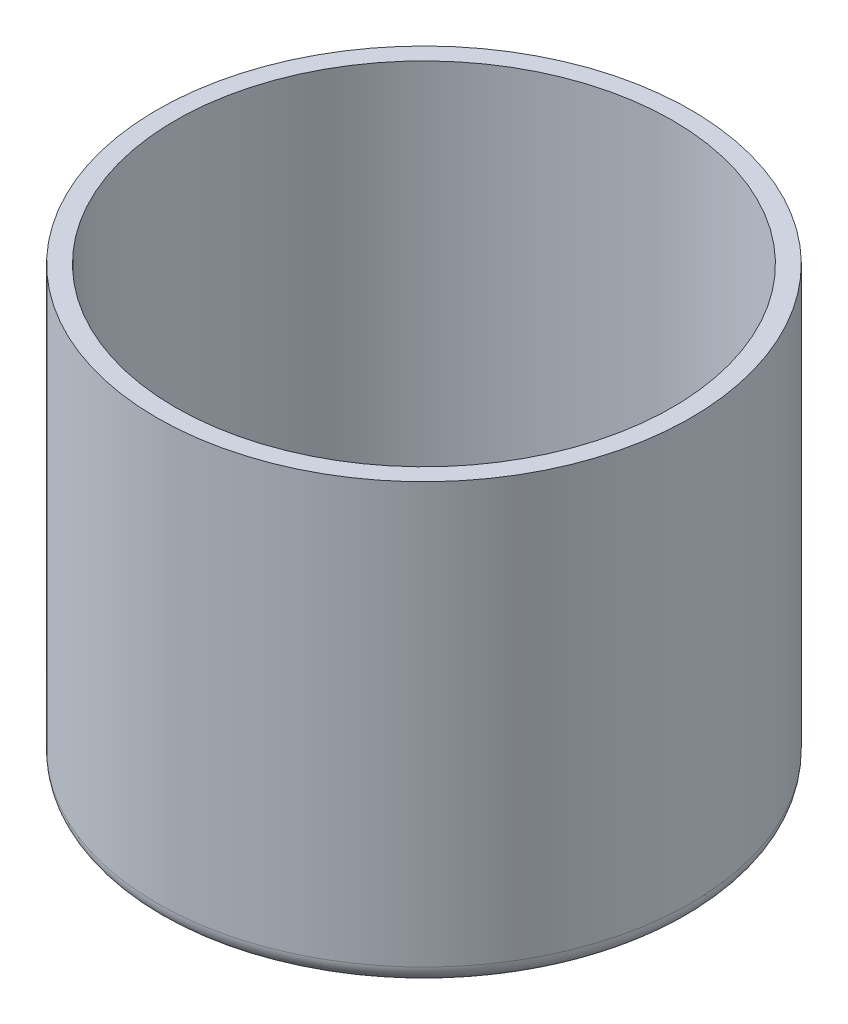
ISO-10303-21;
HEADER;
FILE_DESCRIPTION(('STEP AP214'),'2;1');
FILE_NAME('part.step','',(''),(''),'','','');
FILE_SCHEMA(('AUTOMOTIVE_DESIGN { 1 0 10303 214 1 1 1 1 }'));
ENDSEC;
DATA;
#1=APPLICATION_CONTEXT('core data for automotive mechanical design processes');
#2=APPLICATION_PROTOCOL_DEFINITION('international standard','automotive_design',2000,#1);
#3=PRODUCT_CONTEXT('',#1,'mechanical');
#4=PRODUCT('Part','Part','',(#3));
#5=PRODUCT_RELATED_PRODUCT_CATEGORY('part','',(#4));
#6=PRODUCT_DEFINITION_FORMATION('','',#4);
#7=PRODUCT_DEFINITION_CONTEXT('part definition',#1,'design');
#8=PRODUCT_DEFINITION('design','',#6,#7);
#9=PRODUCT_DEFINITION_SHAPE('','',#8);
#10=(LENGTH_UNIT() NAMED_UNIT(*) SI_UNIT(.MILLI.,.METRE.));
#11=(NAMED_UNIT(*) PLANE_ANGLE_UNIT() SI_UNIT($,.RADIAN.));
#12=(NAMED_UNIT(*) SI_UNIT($,.STERADIAN.) SOLID_ANGLE_UNIT());
#13=UNCERTAINTY_MEASURE_WITH_UNIT(LENGTH_MEASURE(1.E-05),#10,'distance_accuracy_value','');
#14=(GEOMETRIC_REPRESENTATION_CONTEXT(3) GLOBAL_UNCERTAINTY_ASSIGNED_CONTEXT((#13)) GLOBAL_UNIT_ASSIGNED_CONTEXT((#10,
#11,#12)) REPRESENTATION_CONTEXT('',''));
#15=CARTESIAN_POINT('',(0.,0.,0.));
#16=DIRECTION('',(0.,0.,1.));
#17=DIRECTION('',(1.,0.,0.));
#18=AXIS2_PLACEMENT_3D('',#15,#16,#17);
#19=CARTESIAN_POINT('',(0.,115.,0.));
#20=DIRECTION('',(0.,-1.,0.));
#21=DIRECTION('',(0.,0.,-1.));
#22=AXIS2_PLACEMENT_3D('',#19,#20,#21);
#23=CYLINDRICAL_SURFACE('',#22,73.);
#24=CARTESIAN_POINT('',(0.,0.,0.));
#25=DIRECTION('',(0.,1.,0.));
#26=DIRECTION('',(0.,0.,1.));
#27=AXIS2_PLACEMENT_3D('',#24,#25,#26);
#28=CIRCLE('',#27,73.);
#29=CARTESIAN_POINT('',(0.,0.,73.));
#30=VERTEX_POINT('',#29);
#31=EDGE_CURVE('E50',#30,#30,#28,.T.);
#32=ORIENTED_EDGE('',*,*,#31,.T.);
#33=EDGE_LOOP('',(#32));
#34=FACE_BOUND('',#33,.T.);
#35=CARTESIAN_POINT('',(0.,115.,0.));
#36=DIRECTION('',(0.,1.,0.));
#37=DIRECTION('',(0.,0.,1.));
#38=AXIS2_PLACEMENT_3D('',#35,#36,#37);
#39=CIRCLE('',#38,73.);
#40=CARTESIAN_POINT('',(0.,115.,73.));
#41=VERTEX_POINT('',#40);
#42=EDGE_CURVE('E53',#41,#41,#39,.T.);
#43=ORIENTED_EDGE('',*,*,#42,.F.);
#44=EDGE_LOOP('',(#43));
#45=FACE_BOUND('',#44,.T.);
#46=ADVANCED_FACE('F33',(#34,#45),#23,.T.);
#47=CARTESIAN_POINT('',(0.,115.,0.));
#48=DIRECTION('',(0.,1.,0.));
#49=DIRECTION('',(0.,0.,1.));
#50=AXIS2_PLACEMENT_3D('',#47,#48,#49);
#51=PLANE('',#50);
#52=CARTESIAN_POINT('',(0.,115.,0.));
#53=DIRECTION('',(0.,1.,0.));
#54=DIRECTION('',(0.,0.,1.));
#55=AXIS2_PLACEMENT_3D('',#52,#53,#54);
#56=CIRCLE('',#55,68.);
#57=CARTESIAN_POINT('',(0.,115.,68.));
#58=VERTEX_POINT('',#57);
#59=EDGE_CURVE('E56',#58,#58,#56,.T.);
#60=ORIENTED_EDGE('',*,*,#59,.F.);
#61=EDGE_LOOP('',(#60));
#62=FACE_BOUND('',#61,.T.);
#63=ORIENTED_EDGE('',*,*,#42,.T.);
#64=EDGE_LOOP('',(#63));
#65=FACE_BOUND('',#64,.T.);
#66=ADVANCED_FACE('F66',(#62,#65),#51,.T.);
#67=CARTESIAN_POINT('',(0.,-5.,0.));
#68=DIRECTION('',(0.,1.,0.));
#69=DIRECTION('',(0.,0.,1.));
#70=AXIS2_PLACEMENT_3D('',#67,#68,#69);
#71=PLANE('',#70);
#72=CARTESIAN_POINT('',(0.,-5.,0.));
#73=DIRECTION('',(0.,1.,0.));
#74=DIRECTION('',(0.,0.,1.));
#75=AXIS2_PLACEMENT_3D('',#72,#73,#74);
#76=CIRCLE('',#75,42.5);
#77=CARTESIAN_POINT('',(0.,-5.,42.5));
#78=VERTEX_POINT('',#77);
#79=EDGE_CURVE('E10',#78,#78,#76,.T.);
#80=ORIENTED_EDGE('',*,*,#79,.T.);
#81=EDGE_LOOP('',(#80));
#82=FACE_BOUND('',#81,.T.);
#83=CARTESIAN_POINT('',(0.,-5.,0.));
#84=DIRECTION('',(0.,1.,0.));
#85=DIRECTION('',(0.,0.,1.));
#86=AXIS2_PLACEMENT_3D('',#83,#84,#85);
#87=CIRCLE('',#86,68.);
#88=CARTESIAN_POINT('',(0.,-5.,68.));
#89=VERTEX_POINT('',#88);
#90=EDGE_CURVE('E45',#89,#89,#87,.F.);
#91=ORIENTED_EDGE('',*,*,#90,.T.);
#92=EDGE_LOOP('',(#91));
#93=FACE_BOUND('',#92,.T.);
#94=ADVANCED_FACE('F69',(#82,#93),#71,.F.);
#95=CARTESIAN_POINT('',(0.,115.,0.));
#96=DIRECTION('',(0.,-1.,0.));
#97=DIRECTION('',(0.,0.,-1.));
#98=AXIS2_PLACEMENT_3D('',#95,#96,#97);
#99=CYLINDRICAL_SURFACE('',#98,68.);
#100=ORIENTED_EDGE('',*,*,#59,.T.);
#101=EDGE_LOOP('',(#100));
#102=FACE_BOUND('',#101,.T.);
#103=CARTESIAN_POINT('',(0.,0.,0.));
#104=DIRECTION('',(0.,1.,0.));
#105=DIRECTION('',(0.,0.,1.));
#106=AXIS2_PLACEMENT_3D('',#103,#104,#105);
#107=CIRCLE('',#106,68.);
#108=CARTESIAN_POINT('',(0.,0.,68.));
#109=VERTEX_POINT('',#108);
#110=EDGE_CURVE('E57',#109,#109,#107,.T.);
#111=ORIENTED_EDGE('',*,*,#110,.F.);
#112=EDGE_LOOP('',(#111));
#113=FACE_BOUND('',#112,.T.);
#114=ADVANCED_FACE('F63',(#102,#113),#99,.F.);
#115=CARTESIAN_POINT('',(0.,0.,0.));
#116=DIRECTION('',(0.,1.,0.));
#117=DIRECTION('',(0.,0.,1.));
#118=AXIS2_PLACEMENT_3D('',#115,#116,#117);
#119=PLANE('',#118);
#120=CARTESIAN_POINT('',(0.,0.,0.));
#121=DIRECTION('',(0.,1.,0.));
#122=DIRECTION('',(0.,0.,1.));
#123=AXIS2_PLACEMENT_3D('',#120,#121,#122);
#124=CIRCLE('',#123,42.5);
#125=CARTESIAN_POINT('',(0.,0.,42.5));
#126=VERTEX_POINT('',#125);
#127=EDGE_CURVE('E41',#126,#126,#124,.F.);
#128=ORIENTED_EDGE('',*,*,#127,.T.);
#129=EDGE_LOOP('',(#128));
#130=FACE_BOUND('',#129,.T.);
#131=ORIENTED_EDGE('',*,*,#110,.T.);
#132=EDGE_LOOP('',(#131));
#133=FACE_BOUND('',#132,.T.);
#134=ADVANCED_FACE('F84',(#130,#133),#119,.T.);
#135=CARTESIAN_POINT('',(0.,0.,0.));
#136=DIRECTION('',(0.,1.,0.));
#137=DIRECTION('',(0.,0.,1.));
#138=AXIS2_PLACEMENT_3D('',#135,#136,#137);
#139=TOROIDAL_SURFACE('',#138,68.,5.);
#140=ORIENTED_EDGE('',*,*,#90,.F.);
#141=EDGE_LOOP('',(#140));
#142=FACE_BOUND('',#141,.T.);
#143=ORIENTED_EDGE('',*,*,#31,.F.);
#144=EDGE_LOOP('',(#143));
#145=FACE_BOUND('',#144,.T.);
#146=ADVANCED_FACE('F82',(#142,#145),#139,.T.);
#147=CARTESIAN_POINT('',(0.,-2.5,0.));
#148=DIRECTION('',(0.,1.,0.));
#149=DIRECTION('',(0.,0.,1.));
#150=AXIS2_PLACEMENT_3D('',#147,#148,#149);
#151=TOROIDAL_SURFACE('',#150,42.5,2.5);
#152=ORIENTED_EDGE('',*,*,#79,.F.);
#153=EDGE_LOOP('',(#152));
#154=FACE_BOUND('',#153,.T.);
#155=CARTESIAN_POINT('',(0.,-2.5,0.));
#156=DIRECTION('',(0.,1.,0.));
#157=DIRECTION('',(0.,0.,1.));
#158=AXIS2_PLACEMENT_3D('',#155,#156,#157);
#159=CIRCLE('',#158,40.);
#160=CARTESIAN_POINT('',(0.,-2.5,40.));
#161=VERTEX_POINT('',#160);
#162=EDGE_CURVE('E37',#161,#161,#159,.F.);
#163=ORIENTED_EDGE('',*,*,#162,.F.);
#164=EDGE_LOOP('',(#163));
#165=FACE_BOUND('',#164,.T.);
#166=ADVANCED_FACE('F35',(#154,#165),#151,.T.);
#167=CARTESIAN_POINT('',(0.,-2.5,0.));
#168=DIRECTION('',(0.,1.,0.));
#169=DIRECTION('',(0.,0.,1.));
#170=AXIS2_PLACEMENT_3D('',#167,#168,#169);
#171=TOROIDAL_SURFACE('',#170,42.5,2.5);
#172=ORIENTED_EDGE('',*,*,#127,.F.);
#173=EDGE_LOOP('',(#172));
#174=FACE_BOUND('',#173,.T.);
#175=ORIENTED_EDGE('',*,*,#162,.T.);
#176=EDGE_LOOP('',(#175));
#177=FACE_BOUND('',#176,.T.);
#178=ADVANCED_FACE('F86',(#174,#177),#171,.T.);
#179=CLOSED_SHELL('',(#46,#66,#94,#114,#134,#146,#166,#178));
#180=MANIFOLD_SOLID_BREP('B2',#179);
#181=ADVANCED_BREP_SHAPE_REPRESENTATION('',(#18,#180),#14);
#182=SHAPE_DEFINITION_REPRESENTATION(#9,#181);
ENDSEC;
END-ISO-10303-21;
